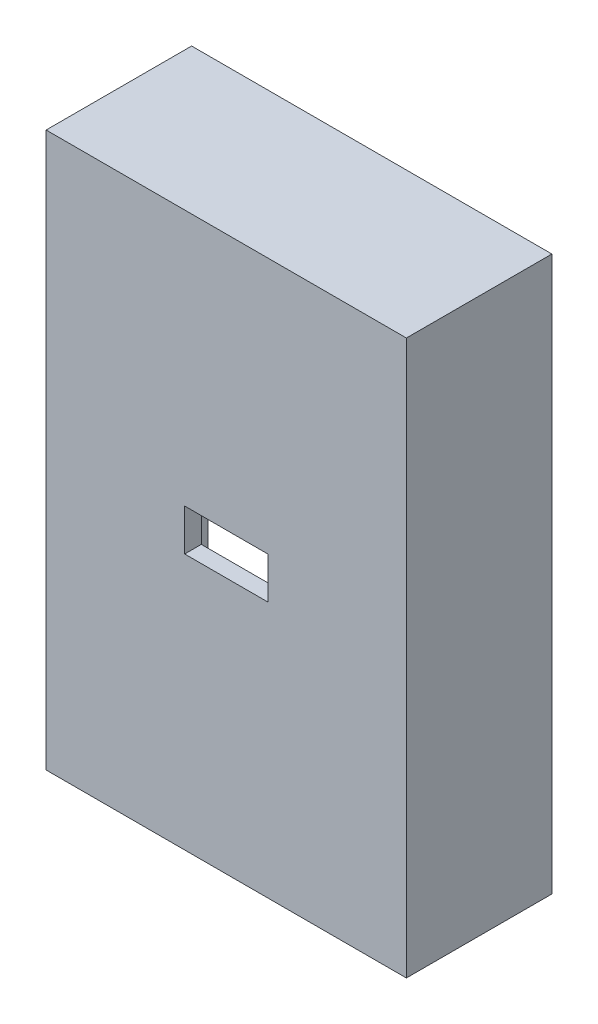
ISO-10303-21;
HEADER;
FILE_DESCRIPTION(('STEP AP214'),'2;1');
FILE_NAME('part.step','',(''),(''),'','','');
FILE_SCHEMA(('AUTOMOTIVE_DESIGN { 1 0 10303 214 1 1 1 1 }'));
ENDSEC;
DATA;
#1=APPLICATION_CONTEXT('core data for automotive mechanical design processes');
#2=APPLICATION_PROTOCOL_DEFINITION('international standard','automotive_design',2000,#1);
#3=PRODUCT_CONTEXT('',#1,'mechanical');
#4=PRODUCT('Part','Part','',(#3));
#5=PRODUCT_RELATED_PRODUCT_CATEGORY('part','',(#4));
#6=PRODUCT_DEFINITION_FORMATION('','',#4);
#7=PRODUCT_DEFINITION_CONTEXT('part definition',#1,'design');
#8=PRODUCT_DEFINITION('design','',#6,#7);
#9=PRODUCT_DEFINITION_SHAPE('','',#8);
#10=(LENGTH_UNIT() NAMED_UNIT(*) SI_UNIT(.MILLI.,.METRE.));
#11=(NAMED_UNIT(*) PLANE_ANGLE_UNIT() SI_UNIT($,.RADIAN.));
#12=(NAMED_UNIT(*) SI_UNIT($,.STERADIAN.) SOLID_ANGLE_UNIT());
#13=UNCERTAINTY_MEASURE_WITH_UNIT(LENGTH_MEASURE(1.E-05),#10,'distance_accuracy_value','');
#14=(GEOMETRIC_REPRESENTATION_CONTEXT(3) GLOBAL_UNCERTAINTY_ASSIGNED_CONTEXT((#13)) GLOBAL_UNIT_ASSIGNED_CONTEXT((#10,
#11,#12)) REPRESENTATION_CONTEXT('',''));
#15=CARTESIAN_POINT('',(0.,0.,0.));
#16=DIRECTION('',(0.,0.,1.));
#17=DIRECTION('',(1.,0.,0.));
#18=AXIS2_PLACEMENT_3D('',#15,#16,#17);
#19=CARTESIAN_POINT('',(0.,0.,1.2));
#20=DIRECTION('',(0.,0.,1.));
#21=DIRECTION('',(1.,0.,0.));
#22=AXIS2_PLACEMENT_3D('',#19,#20,#21);
#23=PLANE('',#22);
#24=DIRECTION('',(0.,-1.,0.));
#25=VECTOR('',#24,1.);
#26=CARTESIAN_POINT('',(-5.,12.,1.2));
#27=LINE('',#26,#25);
#28=CARTESIAN_POINT('',(-5.,12.,1.2));
#29=VERTEX_POINT('',#28);
#30=CARTESIAN_POINT('',(-4.99999999999999,-28.,1.2));
#31=VERTEX_POINT('',#30);
#32=EDGE_CURVE('E255',#29,#31,#27,.T.);
#33=ORIENTED_EDGE('',*,*,#32,.T.);
#34=DIRECTION('',(1.,0.,0.));
#35=VECTOR('',#34,1.);
#36=CARTESIAN_POINT('',(-4.99999999999999,-28.,1.2));
#37=LINE('',#36,#35);
#38=CARTESIAN_POINT('',(21.,-28.,1.2));
#39=VERTEX_POINT('',#38);
#40=EDGE_CURVE('E258',#31,#39,#37,.T.);
#41=ORIENTED_EDGE('',*,*,#40,.T.);
#42=DIRECTION('',(0.,1.,0.));
#43=VECTOR('',#42,1.);
#44=CARTESIAN_POINT('',(21.,12.,1.2));
#45=LINE('',#44,#43);
#46=CARTESIAN_POINT('',(21.,12.,1.2));
#47=VERTEX_POINT('',#46);
#48=EDGE_CURVE('E260',#39,#47,#45,.T.);
#49=ORIENTED_EDGE('',*,*,#48,.T.);
#50=DIRECTION('',(-1.,0.,0.));
#51=VECTOR('',#50,1.);
#52=CARTESIAN_POINT('',(-5.,12.,1.2));
#53=LINE('',#52,#51);
#54=EDGE_CURVE('E262',#47,#29,#53,.T.);
#55=ORIENTED_EDGE('',*,*,#54,.T.);
#56=EDGE_LOOP('',(#33,#41,#49,#55));
#57=FACE_BOUND('',#56,.T.);
#58=DIRECTION('',(1.,0.,0.));
#59=VECTOR('',#58,1.);
#60=CARTESIAN_POINT('',(5.,-9.5,1.2));
#61=LINE('',#60,#59);
#62=CARTESIAN_POINT('',(5.,-9.5,1.2));
#63=VERTEX_POINT('',#62);
#64=CARTESIAN_POINT('',(11.,-9.5,1.2));
#65=VERTEX_POINT('',#64);
#66=EDGE_CURVE('E227',#63,#65,#61,.T.);
#67=ORIENTED_EDGE('',*,*,#66,.F.);
#68=DIRECTION('',(0.,-1.,0.));
#69=VECTOR('',#68,1.);
#70=CARTESIAN_POINT('',(5.,-6.5,1.2));
#71=LINE('',#70,#69);
#72=CARTESIAN_POINT('',(5.,-6.5,1.2));
#73=VERTEX_POINT('',#72);
#74=EDGE_CURVE('E225',#73,#63,#71,.T.);
#75=ORIENTED_EDGE('',*,*,#74,.F.);
#76=DIRECTION('',(-1.,0.,0.));
#77=VECTOR('',#76,1.);
#78=CARTESIAN_POINT('',(5.,-6.5,1.2));
#79=LINE('',#78,#77);
#80=CARTESIAN_POINT('',(11.,-6.5,1.2));
#81=VERTEX_POINT('',#80);
#82=EDGE_CURVE('E233',#81,#73,#79,.T.);
#83=ORIENTED_EDGE('',*,*,#82,.F.);
#84=DIRECTION('',(0.,1.,0.));
#85=VECTOR('',#84,1.);
#86=CARTESIAN_POINT('',(11.,-6.5,1.2));
#87=LINE('',#86,#85);
#88=EDGE_CURVE('E230',#65,#81,#87,.T.);
#89=ORIENTED_EDGE('',*,*,#88,.F.);
#90=EDGE_LOOP('',(#67,#75,#83,#89));
#91=FACE_BOUND('',#90,.T.);
#92=ADVANCED_FACE('F33',(#57,#91),#23,.T.);
#93=CARTESIAN_POINT('',(0.,0.,0.));
#94=DIRECTION('',(0.,0.,1.));
#95=DIRECTION('',(1.,0.,0.));
#96=AXIS2_PLACEMENT_3D('',#93,#94,#95);
#97=PLANE('',#96);
#98=DIRECTION('',(1.,0.,0.));
#99=VECTOR('',#98,1.);
#100=CARTESIAN_POINT('',(16.,0.,0.));
#101=LINE('',#100,#99);
#102=CARTESIAN_POINT('',(0.,0.,0.));
#103=VERTEX_POINT('',#102);
#104=CARTESIAN_POINT('',(16.,0.,0.));
#105=VERTEX_POINT('',#104);
#106=EDGE_CURVE('E198',#103,#105,#101,.T.);
#107=ORIENTED_EDGE('',*,*,#106,.T.);
#108=DIRECTION('',(0.,-1.,0.));
#109=VECTOR('',#108,1.);
#110=CARTESIAN_POINT('',(16.,0.,0.));
#111=LINE('',#110,#109);
#112=CARTESIAN_POINT('',(16.,-16.,0.));
#113=VERTEX_POINT('',#112);
#114=EDGE_CURVE('E194',#105,#113,#111,.T.);
#115=ORIENTED_EDGE('',*,*,#114,.T.);
#116=DIRECTION('',(-1.,0.,0.));
#117=VECTOR('',#116,1.);
#118=CARTESIAN_POINT('',(16.,-16.,0.));
#119=LINE('',#118,#117);
#120=CARTESIAN_POINT('',(0.,-16.,0.));
#121=VERTEX_POINT('',#120);
#122=EDGE_CURVE('E208',#113,#121,#119,.T.);
#123=ORIENTED_EDGE('',*,*,#122,.T.);
#124=DIRECTION('',(0.,1.,0.));
#125=VECTOR('',#124,1.);
#126=CARTESIAN_POINT('',(0.,0.,0.));
#127=LINE('',#126,#125);
#128=EDGE_CURVE('E211',#121,#103,#127,.T.);
#129=ORIENTED_EDGE('',*,*,#128,.T.);
#130=EDGE_LOOP('',(#107,#115,#123,#129));
#131=FACE_BOUND('',#130,.T.);
#132=DIRECTION('',(0.,-1.,0.));
#133=VECTOR('',#132,1.);
#134=CARTESIAN_POINT('',(5.,-6.5,0.));
#135=LINE('',#134,#133);
#136=CARTESIAN_POINT('',(5.,-6.5,0.));
#137=VERTEX_POINT('',#136);
#138=CARTESIAN_POINT('',(5.,-9.5,0.));
#139=VERTEX_POINT('',#138);
#140=EDGE_CURVE('E224',#137,#139,#135,.T.);
#141=ORIENTED_EDGE('',*,*,#140,.T.);
#142=DIRECTION('',(1.,0.,0.));
#143=VECTOR('',#142,1.);
#144=CARTESIAN_POINT('',(5.,-9.5,0.));
#145=LINE('',#144,#143);
#146=CARTESIAN_POINT('',(11.,-9.5,0.));
#147=VERTEX_POINT('',#146);
#148=EDGE_CURVE('E238',#139,#147,#145,.T.);
#149=ORIENTED_EDGE('',*,*,#148,.T.);
#150=DIRECTION('',(0.,1.,0.));
#151=VECTOR('',#150,1.);
#152=CARTESIAN_POINT('',(11.,-6.5,0.));
#153=LINE('',#152,#151);
#154=CARTESIAN_POINT('',(11.,-6.5,0.));
#155=VERTEX_POINT('',#154);
#156=EDGE_CURVE('E241',#147,#155,#153,.T.);
#157=ORIENTED_EDGE('',*,*,#156,.T.);
#158=DIRECTION('',(-1.,0.,0.));
#159=VECTOR('',#158,1.);
#160=CARTESIAN_POINT('',(5.,-6.5,0.));
#161=LINE('',#160,#159);
#162=EDGE_CURVE('E228',#155,#137,#161,.T.);
#163=ORIENTED_EDGE('',*,*,#162,.T.);
#164=EDGE_LOOP('',(#141,#149,#157,#163));
#165=FACE_BOUND('',#164,.T.);
#166=ADVANCED_FACE('F290',(#131,#165),#97,.F.);
#167=CARTESIAN_POINT('',(-5.,12.,1.2));
#168=DIRECTION('',(1.,0.,0.));
#169=DIRECTION('',(0.,1.,0.));
#170=AXIS2_PLACEMENT_3D('',#167,#168,#169);
#171=PLANE('',#170);
#172=DIRECTION('',(0.,0.,-1.));
#173=VECTOR('',#172,1.);
#174=CARTESIAN_POINT('',(-5.,12.,1.2));
#175=LINE('',#174,#173);
#176=CARTESIAN_POINT('',(-4.99999999999999,12.,-9.3));
#177=VERTEX_POINT('',#176);
#178=EDGE_CURVE('E264',#29,#177,#175,.T.);
#179=ORIENTED_EDGE('',*,*,#178,.T.);
#180=DIRECTION('',(0.,1.,0.));
#181=VECTOR('',#180,1.);
#182=CARTESIAN_POINT('',(-4.99999999999999,12.,-9.3));
#183=LINE('',#182,#181);
#184=CARTESIAN_POINT('',(-4.99999999999999,-28.,-9.3));
#185=VERTEX_POINT('',#184);
#186=EDGE_CURVE('E188',#185,#177,#183,.T.);
#187=ORIENTED_EDGE('',*,*,#186,.F.);
#188=DIRECTION('',(0.,0.,-1.));
#189=VECTOR('',#188,1.);
#190=CARTESIAN_POINT('',(-4.99999999999999,-28.,1.2));
#191=LINE('',#190,#189);
#192=EDGE_CURVE('E11',#31,#185,#191,.T.);
#193=ORIENTED_EDGE('',*,*,#192,.F.);
#194=ORIENTED_EDGE('',*,*,#32,.F.);
#195=EDGE_LOOP('',(#179,#187,#193,#194));
#196=FACE_BOUND('',#195,.T.);
#197=ADVANCED_FACE('F35',(#196),#171,.F.);
#198=CARTESIAN_POINT('',(-4.99999999999999,-28.,1.2));
#199=DIRECTION('',(0.,1.,0.));
#200=DIRECTION('',(0.,0.,1.));
#201=AXIS2_PLACEMENT_3D('',#198,#199,#200);
#202=PLANE('',#201);
#203=CARTESIAN_POINT('',(8.,-28.,-4.05));
#204=DIRECTION('',(0.,-1.,0.));
#205=DIRECTION('',(0.,0.,-1.));
#206=AXIS2_PLACEMENT_3D('',#203,#204,#205);
#207=CIRCLE('',#206,2.);
#208=CARTESIAN_POINT('',(8.,-28.,-6.05));
#209=VERTEX_POINT('',#208);
#210=EDGE_CURVE('E510',#209,#209,#207,.T.);
#211=ORIENTED_EDGE('',*,*,#210,.F.);
#212=EDGE_LOOP('',(#211));
#213=FACE_BOUND('',#212,.T.);
#214=ORIENTED_EDGE('',*,*,#192,.T.);
#215=DIRECTION('',(-1.,0.,0.));
#216=VECTOR('',#215,1.);
#217=CARTESIAN_POINT('',(21.,-28.,-9.3));
#218=LINE('',#217,#216);
#219=CARTESIAN_POINT('',(21.,-28.,-9.3));
#220=VERTEX_POINT('',#219);
#221=EDGE_CURVE('E185',#220,#185,#218,.T.);
#222=ORIENTED_EDGE('',*,*,#221,.F.);
#223=DIRECTION('',(0.,0.,-1.));
#224=VECTOR('',#223,1.);
#225=CARTESIAN_POINT('',(21.,-28.,1.2));
#226=LINE('',#225,#224);
#227=EDGE_CURVE('E42',#39,#220,#226,.T.);
#228=ORIENTED_EDGE('',*,*,#227,.F.);
#229=ORIENTED_EDGE('',*,*,#40,.F.);
#230=EDGE_LOOP('',(#214,#222,#228,#229));
#231=FACE_BOUND('',#230,.T.);
#232=ADVANCED_FACE('F276',(#213,#231),#202,.F.);
#233=CARTESIAN_POINT('',(21.,12.,1.2));
#234=DIRECTION('',(-1.,0.,0.));
#235=DIRECTION('',(0.,-1.,0.));
#236=AXIS2_PLACEMENT_3D('',#233,#234,#235);
#237=PLANE('',#236);
#238=ORIENTED_EDGE('',*,*,#227,.T.);
#239=DIRECTION('',(0.,-1.,0.));
#240=VECTOR('',#239,1.);
#241=CARTESIAN_POINT('',(21.,12.,-9.3));
#242=LINE('',#241,#240);
#243=CARTESIAN_POINT('',(21.,12.,-9.3));
#244=VERTEX_POINT('',#243);
#245=EDGE_CURVE('E160',#244,#220,#242,.T.);
#246=ORIENTED_EDGE('',*,*,#245,.F.);
#247=DIRECTION('',(0.,0.,-1.));
#248=VECTOR('',#247,1.);
#249=CARTESIAN_POINT('',(21.,12.,1.2));
#250=LINE('',#249,#248);
#251=EDGE_CURVE('E266',#47,#244,#250,.T.);
#252=ORIENTED_EDGE('',*,*,#251,.F.);
#253=ORIENTED_EDGE('',*,*,#48,.F.);
#254=EDGE_LOOP('',(#238,#246,#252,#253));
#255=FACE_BOUND('',#254,.T.);
#256=ADVANCED_FACE('F273',(#255),#237,.F.);
#257=CARTESIAN_POINT('',(-5.,12.,1.2));
#258=DIRECTION('',(0.,-1.,0.));
#259=DIRECTION('',(0.,0.,-1.));
#260=AXIS2_PLACEMENT_3D('',#257,#258,#259);
#261=PLANE('',#260);
#262=ORIENTED_EDGE('',*,*,#251,.T.);
#263=DIRECTION('',(1.,0.,0.));
#264=VECTOR('',#263,1.);
#265=CARTESIAN_POINT('',(21.,12.,-9.3));
#266=LINE('',#265,#264);
#267=EDGE_CURVE('E191',#177,#244,#266,.T.);
#268=ORIENTED_EDGE('',*,*,#267,.F.);
#269=ORIENTED_EDGE('',*,*,#178,.F.);
#270=ORIENTED_EDGE('',*,*,#54,.F.);
#271=EDGE_LOOP('',(#262,#268,#269,#270));
#272=FACE_BOUND('',#271,.T.);
#273=ADVANCED_FACE('F283',(#272),#261,.F.);
#274=CARTESIAN_POINT('',(5.,-6.5,1.2));
#275=DIRECTION('',(1.,0.,0.));
#276=DIRECTION('',(0.,1.,0.));
#277=AXIS2_PLACEMENT_3D('',#274,#275,#276);
#278=PLANE('',#277);
#279=ORIENTED_EDGE('',*,*,#140,.F.);
#280=DIRECTION('',(0.,0.,-1.));
#281=VECTOR('',#280,1.);
#282=CARTESIAN_POINT('',(5.,-6.5,1.2));
#283=LINE('',#282,#281);
#284=EDGE_CURVE('E235',#73,#137,#283,.T.);
#285=ORIENTED_EDGE('',*,*,#284,.F.);
#286=ORIENTED_EDGE('',*,*,#74,.T.);
#287=DIRECTION('',(0.,0.,-1.));
#288=VECTOR('',#287,1.);
#289=CARTESIAN_POINT('',(5.,-9.5,1.2));
#290=LINE('',#289,#288);
#291=EDGE_CURVE('E252',#63,#139,#290,.T.);
#292=ORIENTED_EDGE('',*,*,#291,.T.);
#293=EDGE_LOOP('',(#279,#285,#286,#292));
#294=FACE_BOUND('',#293,.T.);
#295=ADVANCED_FACE('F303',(#294),#278,.T.);
#296=CARTESIAN_POINT('',(5.,-9.5,1.2));
#297=DIRECTION('',(0.,1.,0.));
#298=DIRECTION('',(0.,0.,1.));
#299=AXIS2_PLACEMENT_3D('',#296,#297,#298);
#300=PLANE('',#299);
#301=ORIENTED_EDGE('',*,*,#148,.F.);
#302=ORIENTED_EDGE('',*,*,#291,.F.);
#303=ORIENTED_EDGE('',*,*,#66,.T.);
#304=DIRECTION('',(0.,0.,-1.));
#305=VECTOR('',#304,1.);
#306=CARTESIAN_POINT('',(11.,-9.5,1.2));
#307=LINE('',#306,#305);
#308=EDGE_CURVE('E250',#65,#147,#307,.T.);
#309=ORIENTED_EDGE('',*,*,#308,.T.);
#310=EDGE_LOOP('',(#301,#302,#303,#309));
#311=FACE_BOUND('',#310,.T.);
#312=ADVANCED_FACE('F324',(#311),#300,.T.);
#313=CARTESIAN_POINT('',(11.,-6.5,1.2));
#314=DIRECTION('',(-1.,0.,0.));
#315=DIRECTION('',(0.,0.,1.));
#316=AXIS2_PLACEMENT_3D('',#313,#314,#315);
#317=PLANE('',#316);
#318=ORIENTED_EDGE('',*,*,#156,.F.);
#319=ORIENTED_EDGE('',*,*,#308,.F.);
#320=ORIENTED_EDGE('',*,*,#88,.T.);
#321=DIRECTION('',(0.,0.,-1.));
#322=VECTOR('',#321,1.);
#323=CARTESIAN_POINT('',(11.,-6.5,1.2));
#324=LINE('',#323,#322);
#325=EDGE_CURVE('E248',#81,#155,#324,.T.);
#326=ORIENTED_EDGE('',*,*,#325,.T.);
#327=EDGE_LOOP('',(#318,#319,#320,#326));
#328=FACE_BOUND('',#327,.T.);
#329=ADVANCED_FACE('F331',(#328),#317,.T.);
#330=CARTESIAN_POINT('',(5.,-6.5,1.2));
#331=DIRECTION('',(0.,-1.,0.));
#332=DIRECTION('',(0.,0.,-1.));
#333=AXIS2_PLACEMENT_3D('',#330,#331,#332);
#334=PLANE('',#333);
#335=ORIENTED_EDGE('',*,*,#162,.F.);
#336=ORIENTED_EDGE('',*,*,#325,.F.);
#337=ORIENTED_EDGE('',*,*,#82,.T.);
#338=ORIENTED_EDGE('',*,*,#284,.T.);
#339=EDGE_LOOP('',(#335,#336,#337,#338));
#340=FACE_BOUND('',#339,.T.);
#341=ADVANCED_FACE('F338',(#340),#334,.T.);
#342=CARTESIAN_POINT('',(0.,0.,-1.3));
#343=DIRECTION('',(0.,0.,-1.));
#344=DIRECTION('',(-1.,0.,0.));
#345=AXIS2_PLACEMENT_3D('',#342,#343,#344);
#346=PLANE('',#345);
#347=DIRECTION('',(1.,0.,0.));
#348=VECTOR('',#347,1.);
#349=CARTESIAN_POINT('',(19.8,10.8,-1.3));
#350=LINE('',#349,#348);
#351=CARTESIAN_POINT('',(-3.79999999999999,10.8,-1.3));
#352=VERTEX_POINT('',#351);
#353=CARTESIAN_POINT('',(19.8,10.8,-1.3));
#354=VERTEX_POINT('',#353);
#355=EDGE_CURVE('E49',#352,#354,#350,.T.);
#356=ORIENTED_EDGE('',*,*,#355,.T.);
#357=DIRECTION('',(0.,-1.,0.));
#358=VECTOR('',#357,1.);
#359=CARTESIAN_POINT('',(19.8,10.8,-1.3));
#360=LINE('',#359,#358);
#361=CARTESIAN_POINT('',(19.8,-26.8,-1.3));
#362=VERTEX_POINT('',#361);
#363=EDGE_CURVE('E53',#354,#362,#360,.T.);
#364=ORIENTED_EDGE('',*,*,#363,.T.);
#365=DIRECTION('',(-1.,0.,0.));
#366=VECTOR('',#365,1.);
#367=CARTESIAN_POINT('',(19.8,-26.8,-1.3));
#368=LINE('',#367,#366);
#369=CARTESIAN_POINT('',(-3.79999999999999,-26.8,-1.3));
#370=VERTEX_POINT('',#369);
#371=EDGE_CURVE('E175',#362,#370,#368,.T.);
#372=ORIENTED_EDGE('',*,*,#371,.T.);
#373=DIRECTION('',(0.,1.,0.));
#374=VECTOR('',#373,1.);
#375=CARTESIAN_POINT('',(-3.79999999999999,10.8,-1.3));
#376=LINE('',#375,#374);
#377=EDGE_CURVE('E155',#370,#352,#376,.T.);
#378=ORIENTED_EDGE('',*,*,#377,.T.);
#379=EDGE_LOOP('',(#356,#364,#372,#378));
#380=FACE_BOUND('',#379,.T.);
#381=DIRECTION('',(-1.,0.,0.));
#382=VECTOR('',#381,1.);
#383=CARTESIAN_POINT('',(16.,-16.,-1.3));
#384=LINE('',#383,#382);
#385=CARTESIAN_POINT('',(16.,-16.,-1.3));
#386=VERTEX_POINT('',#385);
#387=CARTESIAN_POINT('',(0.,-16.,-1.3));
#388=VERTEX_POINT('',#387);
#389=EDGE_CURVE('E197',#386,#388,#384,.T.);
#390=ORIENTED_EDGE('',*,*,#389,.F.);
#391=DIRECTION('',(0.,-1.,0.));
#392=VECTOR('',#391,1.);
#393=CARTESIAN_POINT('',(16.,0.,-1.3));
#394=LINE('',#393,#392);
#395=CARTESIAN_POINT('',(16.,0.,-1.3));
#396=VERTEX_POINT('',#395);
#397=EDGE_CURVE('E195',#396,#386,#394,.T.);
#398=ORIENTED_EDGE('',*,*,#397,.F.);
#399=DIRECTION('',(1.,0.,0.));
#400=VECTOR('',#399,1.);
#401=CARTESIAN_POINT('',(16.,0.,-1.3));
#402=LINE('',#401,#400);
#403=CARTESIAN_POINT('',(0.,0.,-1.3));
#404=VERTEX_POINT('',#403);
#405=EDGE_CURVE('E203',#404,#396,#402,.T.);
#406=ORIENTED_EDGE('',*,*,#405,.F.);
#407=DIRECTION('',(0.,1.,0.));
#408=VECTOR('',#407,1.);
#409=CARTESIAN_POINT('',(0.,0.,-1.3));
#410=LINE('',#409,#408);
#411=EDGE_CURVE('E200',#388,#404,#410,.T.);
#412=ORIENTED_EDGE('',*,*,#411,.F.);
#413=EDGE_LOOP('',(#390,#398,#406,#412));
#414=FACE_BOUND('',#413,.T.);
#415=ADVANCED_FACE('F346',(#380,#414),#346,.T.);
#416=CARTESIAN_POINT('',(16.,0.,-1.3));
#417=DIRECTION('',(-1.,0.,0.));
#418=DIRECTION('',(0.,0.,1.));
#419=AXIS2_PLACEMENT_3D('',#416,#417,#418);
#420=PLANE('',#419);
#421=ORIENTED_EDGE('',*,*,#114,.F.);
#422=DIRECTION('',(0.,0.,1.));
#423=VECTOR('',#422,1.);
#424=CARTESIAN_POINT('',(16.,0.,-1.3));
#425=LINE('',#424,#423);
#426=EDGE_CURVE('E205',#396,#105,#425,.T.);
#427=ORIENTED_EDGE('',*,*,#426,.F.);
#428=ORIENTED_EDGE('',*,*,#397,.T.);
#429=DIRECTION('',(0.,0.,1.));
#430=VECTOR('',#429,1.);
#431=CARTESIAN_POINT('',(16.,-16.,-1.3));
#432=LINE('',#431,#430);
#433=EDGE_CURVE('E221',#386,#113,#432,.T.);
#434=ORIENTED_EDGE('',*,*,#433,.T.);
#435=EDGE_LOOP('',(#421,#427,#428,#434));
#436=FACE_BOUND('',#435,.T.);
#437=ADVANCED_FACE('F354',(#436),#420,.T.);
#438=CARTESIAN_POINT('',(16.,-16.,-1.3));
#439=DIRECTION('',(0.,1.,0.));
#440=DIRECTION('',(-1.,0.,0.));
#441=AXIS2_PLACEMENT_3D('',#438,#439,#440);
#442=PLANE('',#441);
#443=ORIENTED_EDGE('',*,*,#122,.F.);
#444=ORIENTED_EDGE('',*,*,#433,.F.);
#445=ORIENTED_EDGE('',*,*,#389,.T.);
#446=DIRECTION('',(0.,0.,1.));
#447=VECTOR('',#446,1.);
#448=CARTESIAN_POINT('',(0.,-16.,-1.3));
#449=LINE('',#448,#447);
#450=EDGE_CURVE('E219',#388,#121,#449,.T.);
#451=ORIENTED_EDGE('',*,*,#450,.T.);
#452=EDGE_LOOP('',(#443,#444,#445,#451));
#453=FACE_BOUND('',#452,.T.);
#454=ADVANCED_FACE('F362',(#453),#442,.T.);
#455=CARTESIAN_POINT('',(0.,0.,-1.3));
#456=DIRECTION('',(1.,0.,0.));
#457=DIRECTION('',(0.,1.,0.));
#458=AXIS2_PLACEMENT_3D('',#455,#456,#457);
#459=PLANE('',#458);
#460=ORIENTED_EDGE('',*,*,#128,.F.);
#461=ORIENTED_EDGE('',*,*,#450,.F.);
#462=ORIENTED_EDGE('',*,*,#411,.T.);
#463=DIRECTION('',(0.,0.,1.));
#464=VECTOR('',#463,1.);
#465=CARTESIAN_POINT('',(0.,0.,-1.3));
#466=LINE('',#465,#464);
#467=EDGE_CURVE('E217',#404,#103,#466,.T.);
#468=ORIENTED_EDGE('',*,*,#467,.T.);
#469=EDGE_LOOP('',(#460,#461,#462,#468));
#470=FACE_BOUND('',#469,.T.);
#471=ADVANCED_FACE('F370',(#470),#459,.T.);
#472=CARTESIAN_POINT('',(16.,0.,-1.3));
#473=DIRECTION('',(0.,-1.,0.));
#474=DIRECTION('',(1.,0.,0.));
#475=AXIS2_PLACEMENT_3D('',#472,#473,#474);
#476=PLANE('',#475);
#477=ORIENTED_EDGE('',*,*,#106,.F.);
#478=ORIENTED_EDGE('',*,*,#467,.F.);
#479=ORIENTED_EDGE('',*,*,#405,.T.);
#480=ORIENTED_EDGE('',*,*,#426,.T.);
#481=EDGE_LOOP('',(#477,#478,#479,#480));
#482=FACE_BOUND('',#481,.T.);
#483=ADVANCED_FACE('F378',(#482),#476,.T.);
#484=CARTESIAN_POINT('',(0.,0.,-9.3));
#485=DIRECTION('',(0.,0.,-1.));
#486=DIRECTION('',(-1.,0.,0.));
#487=AXIS2_PLACEMENT_3D('',#484,#485,#486);
#488=PLANE('',#487);
#489=ORIENTED_EDGE('',*,*,#245,.T.);
#490=ORIENTED_EDGE('',*,*,#221,.T.);
#491=ORIENTED_EDGE('',*,*,#186,.T.);
#492=ORIENTED_EDGE('',*,*,#267,.T.);
#493=EDGE_LOOP('',(#489,#490,#491,#492));
#494=FACE_BOUND('',#493,.T.);
#495=DIRECTION('',(0.,-1.,0.));
#496=VECTOR('',#495,1.);
#497=CARTESIAN_POINT('',(19.8,10.8,-9.3));
#498=LINE('',#497,#496);
#499=CARTESIAN_POINT('',(19.8,10.8,-9.3));
#500=VERTEX_POINT('',#499);
#501=CARTESIAN_POINT('',(19.8,-26.8,-9.3));
#502=VERTEX_POINT('',#501);
#503=EDGE_CURVE('E154',#500,#502,#498,.T.);
#504=ORIENTED_EDGE('',*,*,#503,.F.);
#505=DIRECTION('',(1.,0.,0.));
#506=VECTOR('',#505,1.);
#507=CARTESIAN_POINT('',(19.8,10.8,-9.3));
#508=LINE('',#507,#506);
#509=CARTESIAN_POINT('',(-3.79999999999999,10.8,-9.3));
#510=VERTEX_POINT('',#509);
#511=EDGE_CURVE('E145',#510,#500,#508,.T.);
#512=ORIENTED_EDGE('',*,*,#511,.F.);
#513=DIRECTION('',(0.,1.,0.));
#514=VECTOR('',#513,1.);
#515=CARTESIAN_POINT('',(-3.79999999999999,10.8,-9.3));
#516=LINE('',#515,#514);
#517=CARTESIAN_POINT('',(-3.79999999999999,-26.8,-9.3));
#518=VERTEX_POINT('',#517);
#519=EDGE_CURVE('E168',#518,#510,#516,.T.);
#520=ORIENTED_EDGE('',*,*,#519,.F.);
#521=DIRECTION('',(-1.,0.,0.));
#522=VECTOR('',#521,1.);
#523=CARTESIAN_POINT('',(19.8,-26.8,-9.3));
#524=LINE('',#523,#522);
#525=EDGE_CURVE('E166',#502,#518,#524,.T.);
#526=ORIENTED_EDGE('',*,*,#525,.F.);
#527=EDGE_LOOP('',(#504,#512,#520,#526));
#528=FACE_BOUND('',#527,.T.);
#529=ADVANCED_FACE('F164',(#494,#528),#488,.T.);
#530=CARTESIAN_POINT('',(19.8,10.8,-9.3));
#531=DIRECTION('',(0.,-1.,0.));
#532=DIRECTION('',(0.,0.,-1.));
#533=AXIS2_PLACEMENT_3D('',#530,#531,#532);
#534=PLANE('',#533);
#535=ORIENTED_EDGE('',*,*,#355,.F.);
#536=DIRECTION('',(0.,0.,1.));
#537=VECTOR('',#536,1.);
#538=CARTESIAN_POINT('',(-3.79999999999999,10.8,-9.3));
#539=LINE('',#538,#537);
#540=EDGE_CURVE('E150',#510,#352,#539,.T.);
#541=ORIENTED_EDGE('',*,*,#540,.F.);
#542=ORIENTED_EDGE('',*,*,#511,.T.);
#543=DIRECTION('',(0.,0.,1.));
#544=VECTOR('',#543,1.);
#545=CARTESIAN_POINT('',(19.8,10.8,-9.3));
#546=LINE('',#545,#544);
#547=EDGE_CURVE('E148',#500,#354,#546,.T.);
#548=ORIENTED_EDGE('',*,*,#547,.T.);
#549=EDGE_LOOP('',(#535,#541,#542,#548));
#550=FACE_BOUND('',#549,.T.);
#551=ADVANCED_FACE('F147',(#550),#534,.T.);
#552=CARTESIAN_POINT('',(19.8,10.8,-9.3));
#553=DIRECTION('',(-1.,0.,0.));
#554=DIRECTION('',(0.,0.,1.));
#555=AXIS2_PLACEMENT_3D('',#552,#553,#554);
#556=PLANE('',#555);
#557=ORIENTED_EDGE('',*,*,#363,.F.);
#558=ORIENTED_EDGE('',*,*,#547,.F.);
#559=ORIENTED_EDGE('',*,*,#503,.T.);
#560=DIRECTION('',(0.,0.,1.));
#561=VECTOR('',#560,1.);
#562=CARTESIAN_POINT('',(19.8,-26.8,-9.3));
#563=LINE('',#562,#561);
#564=EDGE_CURVE('E161',#502,#362,#563,.T.);
#565=ORIENTED_EDGE('',*,*,#564,.T.);
#566=EDGE_LOOP('',(#557,#558,#559,#565));
#567=FACE_BOUND('',#566,.T.);
#568=ADVANCED_FACE('F158',(#567),#556,.T.);
#569=CARTESIAN_POINT('',(19.8,-26.8,-9.3));
#570=DIRECTION('',(0.,1.,0.));
#571=DIRECTION('',(0.,0.,1.));
#572=AXIS2_PLACEMENT_3D('',#569,#570,#571);
#573=PLANE('',#572);
#574=CARTESIAN_POINT('',(8.,-26.8,-4.05));
#575=DIRECTION('',(0.,1.,0.));
#576=DIRECTION('',(0.,0.,1.));
#577=AXIS2_PLACEMENT_3D('',#574,#575,#576);
#578=CIRCLE('',#577,2.);
#579=CARTESIAN_POINT('',(8.,-26.8,-2.05));
#580=VERTEX_POINT('',#579);
#581=EDGE_CURVE('E37',#580,#580,#578,.T.);
#582=ORIENTED_EDGE('',*,*,#581,.F.);
#583=EDGE_LOOP('',(#582));
#584=FACE_BOUND('',#583,.T.);
#585=ORIENTED_EDGE('',*,*,#371,.F.);
#586=ORIENTED_EDGE('',*,*,#564,.F.);
#587=ORIENTED_EDGE('',*,*,#525,.T.);
#588=DIRECTION('',(0.,0.,1.));
#589=VECTOR('',#588,1.);
#590=CARTESIAN_POINT('',(-3.79999999999999,-26.8,-9.3));
#591=LINE('',#590,#589);
#592=EDGE_CURVE('E179',#518,#370,#591,.T.);
#593=ORIENTED_EDGE('',*,*,#592,.T.);
#594=EDGE_LOOP('',(#585,#586,#587,#593));
#595=FACE_BOUND('',#594,.T.);
#596=ADVANCED_FACE('F404',(#584,#595),#573,.T.);
#597=CARTESIAN_POINT('',(-3.79999999999999,10.8,-9.3));
#598=DIRECTION('',(1.,0.,0.));
#599=DIRECTION('',(0.,1.,0.));
#600=AXIS2_PLACEMENT_3D('',#597,#598,#599);
#601=PLANE('',#600);
#602=ORIENTED_EDGE('',*,*,#377,.F.);
#603=ORIENTED_EDGE('',*,*,#592,.F.);
#604=ORIENTED_EDGE('',*,*,#519,.T.);
#605=ORIENTED_EDGE('',*,*,#540,.T.);
#606=EDGE_LOOP('',(#602,#603,#604,#605));
#607=FACE_BOUND('',#606,.T.);
#608=ADVANCED_FACE('F412',(#607),#601,.T.);
#609=CARTESIAN_POINT('',(8.,-20.,-4.05));
#610=DIRECTION('',(0.,-1.,0.));
#611=DIRECTION('',(0.,0.,-1.));
#612=AXIS2_PLACEMENT_3D('',#609,#610,#611);
#613=CYLINDRICAL_SURFACE('',#612,2.);
#614=ORIENTED_EDGE('',*,*,#581,.T.);
#615=EDGE_LOOP('',(#614));
#616=FACE_BOUND('',#615,.T.);
#617=ORIENTED_EDGE('',*,*,#210,.T.);
#618=EDGE_LOOP('',(#617));
#619=FACE_BOUND('',#618,.T.);
#620=ADVANCED_FACE('F420',(#616,#619),#613,.F.);
#621=CLOSED_SHELL('',(#92,#166,#197,#232,#256,#273,#295,#312,#329,#341,#415,#437,#454,#471,#483,
#529,#551,#568,#596,#608,#620));
#622=MANIFOLD_SOLID_BREP('B2',#621);
#623=ADVANCED_BREP_SHAPE_REPRESENTATION('',(#18,#622),#14);
#624=SHAPE_DEFINITION_REPRESENTATION(#9,#623);
ENDSEC;
END-ISO-10303-21;
